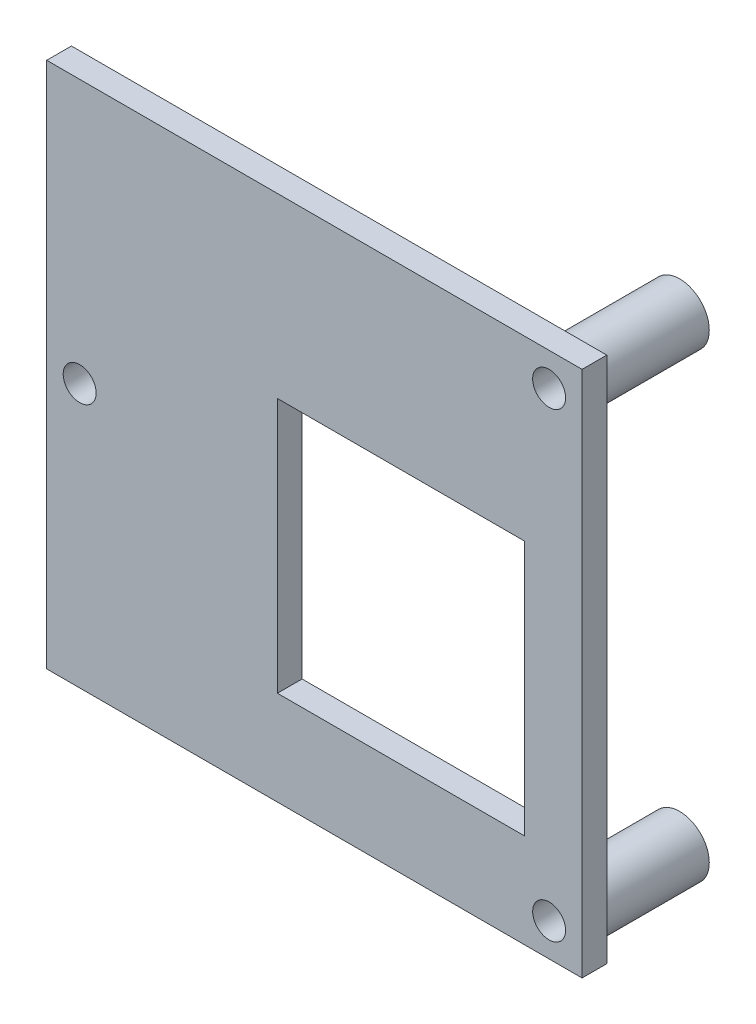
ISO-10303-21;
HEADER;
FILE_DESCRIPTION(('STEP AP214'),'2;1');
FILE_NAME('part.step','',(''),(''),'','','');
FILE_SCHEMA(('AUTOMOTIVE_DESIGN { 1 0 10303 214 1 1 1 1 }'));
ENDSEC;
DATA;
#1=APPLICATION_CONTEXT('core data for automotive mechanical design processes');
#2=APPLICATION_PROTOCOL_DEFINITION('international standard','automotive_design',2000,#1);
#3=PRODUCT_CONTEXT('',#1,'mechanical');
#4=PRODUCT('Part','Part','',(#3));
#5=PRODUCT_RELATED_PRODUCT_CATEGORY('part','',(#4));
#6=PRODUCT_DEFINITION_FORMATION('','',#4);
#7=PRODUCT_DEFINITION_CONTEXT('part definition',#1,'design');
#8=PRODUCT_DEFINITION('design','',#6,#7);
#9=PRODUCT_DEFINITION_SHAPE('','',#8);
#10=(LENGTH_UNIT() NAMED_UNIT(*) SI_UNIT(.MILLI.,.METRE.));
#11=(NAMED_UNIT(*) PLANE_ANGLE_UNIT() SI_UNIT($,.RADIAN.));
#12=(NAMED_UNIT(*) SI_UNIT($,.STERADIAN.) SOLID_ANGLE_UNIT());
#13=UNCERTAINTY_MEASURE_WITH_UNIT(LENGTH_MEASURE(1.E-05),#10,'distance_accuracy_value','');
#14=(GEOMETRIC_REPRESENTATION_CONTEXT(3) GLOBAL_UNCERTAINTY_ASSIGNED_CONTEXT((#13)) GLOBAL_UNIT_ASSIGNED_CONTEXT((#10,
#11,#12)) REPRESENTATION_CONTEXT('',''));
#15=CARTESIAN_POINT('',(0.,0.,0.));
#16=DIRECTION('',(0.,0.,1.));
#17=DIRECTION('',(1.,0.,0.));
#18=AXIS2_PLACEMENT_3D('',#15,#16,#17);
#19=CARTESIAN_POINT('',(0.,-5.58903160180357E-05,1278.62137790184));
#20=DIRECTION('',(0.,-4.3711388675316E-08,0.999999999999999));
#21=DIRECTION('',(0.,-0.999999999999999,-4.3711388675316E-08));
#22=AXIS2_PLACEMENT_3D('',#19,#20,#21);
#23=PLANE('',#22);
#24=DIRECTION('',(1.,0.,0.));
#25=VECTOR('',#24,1.);
#26=CARTESIAN_POINT('',(-227.038243781603,97.901249683913,1278.62138218125));
#27=LINE('',#26,#25);
#28=CARTESIAN_POINT('',(-227.038243781603,97.901249683913,1278.62138218125));
#29=VERTEX_POINT('',#28);
#30=CARTESIAN_POINT('',(-197.038243781603,97.901249683913,1278.62138150372));
#31=VERTEX_POINT('',#30);
#32=EDGE_CURVE('E129',#29,#31,#27,.T.);
#33=ORIENTED_EDGE('',*,*,#32,.F.);
#34=DIRECTION('',(0.,0.999999999999999,4.3711388675316E-08));
#35=VECTOR('',#34,1.);
#36=CARTESIAN_POINT('',(-227.038243781603,97.901249683913,1278.62138218125));
#37=LINE('',#36,#35);
#38=CARTESIAN_POINT('',(-227.038243781603,66.901249683913,1278.62138082619));
#39=VERTEX_POINT('',#38);
#40=EDGE_CURVE('E112',#39,#29,#37,.T.);
#41=ORIENTED_EDGE('',*,*,#40,.F.);
#42=DIRECTION('',(-1.,0.,0.));
#43=VECTOR('',#42,1.);
#44=CARTESIAN_POINT('',(-227.038243781603,66.901249683913,1278.62138082619));
#45=LINE('',#44,#43);
#46=CARTESIAN_POINT('',(-197.038243781603,66.901249683913,1278.62138082619));
#47=VERTEX_POINT('',#46);
#48=EDGE_CURVE('E121',#47,#39,#45,.T.);
#49=ORIENTED_EDGE('',*,*,#48,.F.);
#50=DIRECTION('',(0.,-0.999999999999999,-4.3711388675316E-08));
#51=VECTOR('',#50,1.);
#52=CARTESIAN_POINT('',(-197.038243781603,97.901249683913,1278.62138218125));
#53=LINE('',#52,#51);
#54=EDGE_CURVE('E60',#31,#47,#53,.T.);
#55=ORIENTED_EDGE('',*,*,#54,.F.);
#56=EDGE_LOOP('',(#33,#41,#49,#55));
#57=FACE_BOUND('',#56,.T.);
#58=CARTESIAN_POINT('',(-251.046248068345,87.4548102411924,1278.62138172462));
#59=DIRECTION('',(0.,-4.3711388675316E-08,0.999999999999999));
#60=DIRECTION('',(0.,-0.999999999999999,-4.3711388675316E-08));
#61=AXIS2_PLACEMENT_3D('',#58,#59,#60);
#62=CIRCLE('',#61,3.60000000000001);
#63=CARTESIAN_POINT('',(-251.046248068345,83.8548102411924,1278.62138156726));
#64=VERTEX_POINT('',#63);
#65=EDGE_CURVE('E53',#64,#64,#62,.F.);
#66=ORIENTED_EDGE('',*,*,#65,.F.);
#67=EDGE_LOOP('',(#66));
#68=FACE_BOUND('',#67,.T.);
#69=DIRECTION('',(1.,0.,0.));
#70=VECTOR('',#69,1.);
#71=CARTESIAN_POINT('',(-255.046248068345,55.4548102411925,1278.62138032585));
#72=LINE('',#71,#70);
#73=CARTESIAN_POINT('',(-255.046248068345,55.4548102411925,1278.62138032585));
#74=VERTEX_POINT('',#73);
#75=CARTESIAN_POINT('',(-190.046248068345,55.4548102411925,1278.62138032585));
#76=VERTEX_POINT('',#75);
#77=EDGE_CURVE('E172',#74,#76,#72,.T.);
#78=ORIENTED_EDGE('',*,*,#77,.F.);
#79=DIRECTION('',(0.,-0.999999999999999,-4.3711388675316E-08));
#80=VECTOR('',#79,1.);
#81=CARTESIAN_POINT('',(-255.046248068345,119.454810241192,1278.62138312338));
#82=LINE('',#81,#80);
#83=CARTESIAN_POINT('',(-255.046248068345,119.454810241192,1278.62138312338));
#84=VERTEX_POINT('',#83);
#85=EDGE_CURVE('E177',#84,#74,#82,.T.);
#86=ORIENTED_EDGE('',*,*,#85,.F.);
#87=DIRECTION('',(-1.,0.,0.));
#88=VECTOR('',#87,1.);
#89=CARTESIAN_POINT('',(-190.046248068345,119.454810241192,1278.62138312338));
#90=LINE('',#89,#88);
#91=CARTESIAN_POINT('',(-190.046248068345,119.454810241192,1278.62138312338));
#92=VERTEX_POINT('',#91);
#93=EDGE_CURVE('E188',#92,#84,#90,.T.);
#94=ORIENTED_EDGE('',*,*,#93,.F.);
#95=DIRECTION('',(0.,0.999999999999999,4.3711388675316E-08));
#96=VECTOR('',#95,1.);
#97=CARTESIAN_POINT('',(-190.046248068345,55.4548102411925,1278.62138032585));
#98=LINE('',#97,#96);
#99=EDGE_CURVE('E186',#76,#92,#98,.T.);
#100=ORIENTED_EDGE('',*,*,#99,.F.);
#101=EDGE_LOOP('',(#78,#86,#94,#100));
#102=FACE_BOUND('',#101,.T.);
#103=CARTESIAN_POINT('',(-194.046248068345,115.454810241192,1278.62138294854));
#104=DIRECTION('',(0.,-4.3711388675316E-08,0.999999999999999));
#105=DIRECTION('',(0.,-0.999999999999999,-4.3711388675316E-08));
#106=AXIS2_PLACEMENT_3D('',#103,#104,#105);
#107=CIRCLE('',#106,3.59999999999999);
#108=CARTESIAN_POINT('',(-194.046248068345,111.854810241192,1278.62138279118));
#109=VERTEX_POINT('',#108);
#110=EDGE_CURVE('E202',#109,#109,#107,.F.);
#111=ORIENTED_EDGE('',*,*,#110,.F.);
#112=EDGE_LOOP('',(#111));
#113=FACE_BOUND('',#112,.T.);
#114=CARTESIAN_POINT('',(-194.046248068345,59.4548102411925,1278.6213805007));
#115=DIRECTION('',(0.,-4.3711388675316E-08,0.999999999999999));
#116=DIRECTION('',(0.,-0.999999999999999,-4.3711388675316E-08));
#117=AXIS2_PLACEMENT_3D('',#114,#115,#116);
#118=CIRCLE('',#117,3.59999999999999);
#119=CARTESIAN_POINT('',(-194.046248068345,55.8548102411925,1278.62138034334));
#120=VERTEX_POINT('',#119);
#121=EDGE_CURVE('E11',#120,#120,#118,.F.);
#122=ORIENTED_EDGE('',*,*,#121,.F.);
#123=EDGE_LOOP('',(#122));
#124=FACE_BOUND('',#123,.T.);
#125=ADVANCED_FACE('F45',(#57,#68,#102,#113,#124),#23,.F.);
#126=CARTESIAN_POINT('',(-255.046248068345,55.4548101100584,1281.62138032585));
#127=DIRECTION('',(0.,0.999999999999999,4.3711388E-08));
#128=DIRECTION('',(0.,-4.3711388E-08,0.999999999999999));
#129=AXIS2_PLACEMENT_3D('',#126,#127,#128);
#130=PLANE('',#129);
#131=ORIENTED_EDGE('',*,*,#77,.T.);
#132=DIRECTION('',(0.,4.3711388E-08,-0.999999999999999));
#133=VECTOR('',#132,1.);
#134=CARTESIAN_POINT('',(-190.046248068345,55.4548101100584,1281.62138032585));
#135=LINE('',#134,#133);
#136=CARTESIAN_POINT('',(-190.046248068345,55.4548101100584,1281.62138032585));
#137=VERTEX_POINT('',#136);
#138=EDGE_CURVE('E199',#137,#76,#135,.T.);
#139=ORIENTED_EDGE('',*,*,#138,.F.);
#140=DIRECTION('',(1.,0.,0.));
#141=VECTOR('',#140,1.);
#142=CARTESIAN_POINT('',(-255.046248068345,55.4548101100584,1281.62138032585));
#143=LINE('',#142,#141);
#144=CARTESIAN_POINT('',(-255.046248068345,55.4548101100584,1281.62138032585));
#145=VERTEX_POINT('',#144);
#146=EDGE_CURVE('E173',#145,#137,#143,.T.);
#147=ORIENTED_EDGE('',*,*,#146,.F.);
#148=DIRECTION('',(0.,4.3711388E-08,-0.999999999999999));
#149=VECTOR('',#148,1.);
#150=CARTESIAN_POINT('',(-255.046248068345,55.4548101100584,1281.62138032585));
#151=LINE('',#150,#149);
#152=EDGE_CURVE('E183',#145,#74,#151,.T.);
#153=ORIENTED_EDGE('',*,*,#152,.T.);
#154=EDGE_LOOP('',(#131,#139,#147,#153));
#155=FACE_BOUND('',#154,.T.);
#156=ADVANCED_FACE('F47',(#155),#130,.F.);
#157=CARTESIAN_POINT('',(-190.046248068345,55.4548101100584,1281.62138032585));
#158=DIRECTION('',(-1.,0.,0.));
#159=DIRECTION('',(0.,0.,1.));
#160=AXIS2_PLACEMENT_3D('',#157,#158,#159);
#161=PLANE('',#160);
#162=ORIENTED_EDGE('',*,*,#99,.T.);
#163=DIRECTION('',(0.,4.3711388E-08,-0.999999999999999));
#164=VECTOR('',#163,1.);
#165=CARTESIAN_POINT('',(-190.046248068345,119.454810110058,1281.62138312338));
#166=LINE('',#165,#164);
#167=CARTESIAN_POINT('',(-190.046248068345,119.454810110058,1281.62138312338));
#168=VERTEX_POINT('',#167);
#169=EDGE_CURVE('E196',#168,#92,#166,.T.);
#170=ORIENTED_EDGE('',*,*,#169,.F.);
#171=DIRECTION('',(0.,0.999999999999999,4.3711388675316E-08));
#172=VECTOR('',#171,1.);
#173=CARTESIAN_POINT('',(-190.046248068345,55.4548101100584,1281.62138032585));
#174=LINE('',#173,#172);
#175=EDGE_CURVE('E176',#137,#168,#174,.T.);
#176=ORIENTED_EDGE('',*,*,#175,.F.);
#177=ORIENTED_EDGE('',*,*,#138,.T.);
#178=EDGE_LOOP('',(#162,#170,#176,#177));
#179=FACE_BOUND('',#178,.T.);
#180=ADVANCED_FACE('F267',(#179),#161,.F.);
#181=CARTESIAN_POINT('',(-190.046248068345,119.454810110058,1281.62138312338));
#182=DIRECTION('',(0.,-0.999999999999999,-4.3711388E-08));
#183=DIRECTION('',(0.,4.3711388E-08,-0.999999999999999));
#184=AXIS2_PLACEMENT_3D('',#181,#182,#183);
#185=PLANE('',#184);
#186=ORIENTED_EDGE('',*,*,#93,.T.);
#187=DIRECTION('',(0.,4.3711388E-08,-0.999999999999999));
#188=VECTOR('',#187,1.);
#189=CARTESIAN_POINT('',(-255.046248068345,119.454810110058,1281.62138312338));
#190=LINE('',#189,#188);
#191=CARTESIAN_POINT('',(-255.046248068345,119.454810110058,1281.62138312338));
#192=VERTEX_POINT('',#191);
#193=EDGE_CURVE('E193',#192,#84,#190,.T.);
#194=ORIENTED_EDGE('',*,*,#193,.F.);
#195=DIRECTION('',(-1.,0.,0.));
#196=VECTOR('',#195,1.);
#197=CARTESIAN_POINT('',(-190.046248068345,119.454810110058,1281.62138312338));
#198=LINE('',#197,#196);
#199=EDGE_CURVE('E179',#168,#192,#198,.T.);
#200=ORIENTED_EDGE('',*,*,#199,.F.);
#201=ORIENTED_EDGE('',*,*,#169,.T.);
#202=EDGE_LOOP('',(#186,#194,#200,#201));
#203=FACE_BOUND('',#202,.T.);
#204=ADVANCED_FACE('F264',(#203),#185,.F.);
#205=CARTESIAN_POINT('',(-255.046248068345,119.454810110058,1281.62138312338));
#206=DIRECTION('',(1.,0.,0.));
#207=DIRECTION('',(0.,0.,-1.));
#208=AXIS2_PLACEMENT_3D('',#205,#206,#207);
#209=PLANE('',#208);
#210=ORIENTED_EDGE('',*,*,#85,.T.);
#211=ORIENTED_EDGE('',*,*,#152,.F.);
#212=DIRECTION('',(0.,-0.999999999999999,-4.3711388675316E-08));
#213=VECTOR('',#212,1.);
#214=CARTESIAN_POINT('',(-255.046248068345,119.454810110058,1281.62138312338));
#215=LINE('',#214,#213);
#216=EDGE_CURVE('E181',#192,#145,#215,.T.);
#217=ORIENTED_EDGE('',*,*,#216,.F.);
#218=ORIENTED_EDGE('',*,*,#193,.T.);
#219=EDGE_LOOP('',(#210,#211,#217,#218));
#220=FACE_BOUND('',#219,.T.);
#221=ADVANCED_FACE('F259',(#220),#209,.F.);
#222=CARTESIAN_POINT('',(0.,-5.60214501820357E-05,1281.62137790184));
#223=DIRECTION('',(0.,-4.3711388675316E-08,0.999999999999999));
#224=DIRECTION('',(0.,-0.999999999999999,-4.3711388675316E-08));
#225=AXIS2_PLACEMENT_3D('',#222,#223,#224);
#226=PLANE('',#225);
#227=DIRECTION('',(0.,-0.999999999999999,-4.37113857654572E-08));
#228=VECTOR('',#227,1.);
#229=CARTESIAN_POINT('',(-227.038243781603,97.9012495527788,1281.62138218125));
#230=LINE('',#229,#228);
#231=CARTESIAN_POINT('',(-227.038243781603,97.9012495527788,1281.62138218125));
#232=VERTEX_POINT('',#231);
#233=CARTESIAN_POINT('',(-227.038243781603,66.9012495527788,1281.62138082619));
#234=VERTEX_POINT('',#233);
#235=EDGE_CURVE('E68',#232,#234,#230,.T.);
#236=ORIENTED_EDGE('',*,*,#235,.F.);
#237=DIRECTION('',(-1.,0.,0.));
#238=VECTOR('',#237,1.);
#239=CARTESIAN_POINT('',(-227.038243781603,97.9012495527788,1281.62138218125));
#240=LINE('',#239,#238);
#241=CARTESIAN_POINT('',(-197.038243781603,97.9012495527788,1281.62138218125));
#242=VERTEX_POINT('',#241);
#243=EDGE_CURVE('E118',#242,#232,#240,.T.);
#244=ORIENTED_EDGE('',*,*,#243,.F.);
#245=DIRECTION('',(0.,0.999999999999999,4.37113857654572E-08));
#246=VECTOR('',#245,1.);
#247=CARTESIAN_POINT('',(-197.038243781603,97.9012495527788,1281.62138218125));
#248=LINE('',#247,#246);
#249=CARTESIAN_POINT('',(-197.038243781603,66.9012495527788,1281.62138082619));
#250=VERTEX_POINT('',#249);
#251=EDGE_CURVE('E137',#250,#242,#248,.T.);
#252=ORIENTED_EDGE('',*,*,#251,.F.);
#253=DIRECTION('',(1.,0.,0.));
#254=VECTOR('',#253,1.);
#255=CARTESIAN_POINT('',(-227.038243781603,66.9012495527788,1281.62138082619));
#256=LINE('',#255,#254);
#257=EDGE_CURVE('E131',#234,#250,#256,.T.);
#258=ORIENTED_EDGE('',*,*,#257,.F.);
#259=EDGE_LOOP('',(#236,#244,#252,#258));
#260=FACE_BOUND('',#259,.T.);
#261=CARTESIAN_POINT('',(-251.046248068345,87.4548101100582,1281.62138172462));
#262=DIRECTION('',(0.,-4.3711388675316E-08,0.999999999999999));
#263=DIRECTION('',(0.,-0.999999999999999,-4.3711388675316E-08));
#264=AXIS2_PLACEMENT_3D('',#261,#262,#263);
#265=CIRCLE('',#264,2.);
#266=CARTESIAN_POINT('',(-251.046248068345,85.4548101100582,1281.6213816372));
#267=VERTEX_POINT('',#266);
#268=EDGE_CURVE('E163',#267,#267,#265,.T.);
#269=ORIENTED_EDGE('',*,*,#268,.F.);
#270=EDGE_LOOP('',(#269));
#271=FACE_BOUND('',#270,.T.);
#272=CARTESIAN_POINT('',(-194.046248068345,115.454810110058,1281.62138294854));
#273=DIRECTION('',(0.,-4.3711388675316E-08,0.999999999999999));
#274=DIRECTION('',(0.,-0.999999999999999,-4.3711388675316E-08));
#275=AXIS2_PLACEMENT_3D('',#272,#273,#274);
#276=CIRCLE('',#275,2.);
#277=CARTESIAN_POINT('',(-194.046248068345,113.454810110058,1281.62138286112));
#278=VERTEX_POINT('',#277);
#279=EDGE_CURVE('E166',#278,#278,#276,.T.);
#280=ORIENTED_EDGE('',*,*,#279,.F.);
#281=EDGE_LOOP('',(#280));
#282=FACE_BOUND('',#281,.T.);
#283=CARTESIAN_POINT('',(-194.046248068345,59.4548101100583,1281.6213805007));
#284=DIRECTION('',(0.,-4.3711388675316E-08,0.999999999999999));
#285=DIRECTION('',(0.,-0.999999999999999,-4.3711388675316E-08));
#286=AXIS2_PLACEMENT_3D('',#283,#284,#285);
#287=CIRCLE('',#286,2.);
#288=CARTESIAN_POINT('',(-194.046248068345,57.4548101100583,1281.62138041328));
#289=VERTEX_POINT('',#288);
#290=EDGE_CURVE('E169',#289,#289,#287,.T.);
#291=ORIENTED_EDGE('',*,*,#290,.F.);
#292=EDGE_LOOP('',(#291));
#293=FACE_BOUND('',#292,.T.);
#294=ORIENTED_EDGE('',*,*,#146,.T.);
#295=ORIENTED_EDGE('',*,*,#175,.T.);
#296=ORIENTED_EDGE('',*,*,#199,.T.);
#297=ORIENTED_EDGE('',*,*,#216,.T.);
#298=EDGE_LOOP('',(#294,#295,#296,#297));
#299=FACE_BOUND('',#298,.T.);
#300=ADVANCED_FACE('F256',(#260,#271,#282,#293,#299),#226,.T.);
#301=CARTESIAN_POINT('',(-194.046248068345,59.4548101100583,1281.6213805007));
#302=DIRECTION('',(0.,-4.3711388675316E-08,0.999999999999999));
#303=DIRECTION('',(0.,-0.999999999999999,-4.3711388675316E-08));
#304=AXIS2_PLACEMENT_3D('',#301,#302,#303);
#305=CYLINDRICAL_SURFACE('',#304,2.);
#306=ORIENTED_EDGE('',*,*,#290,.T.);
#307=EDGE_LOOP('',(#306));
#308=FACE_BOUND('',#307,.T.);
#309=CARTESIAN_POINT('',(-194.046248068345,59.4548108026905,1265.7758021895));
#310=DIRECTION('',(0.,0.,1.));
#311=DIRECTION('',(1.,0.,0.));
#312=AXIS2_PLACEMENT_3D('',#309,#310,#311);
#313=CIRCLE('',#312,1.99999999999998);
#314=CARTESIAN_POINT('',(-192.046248068345,59.4548108026905,1265.7758021895));
#315=VERTEX_POINT('',#314);
#316=EDGE_CURVE('E124',#315,#315,#313,.T.);
#317=ORIENTED_EDGE('',*,*,#316,.F.);
#318=EDGE_LOOP('',(#317));
#319=FACE_BOUND('',#318,.T.);
#320=ADVANCED_FACE('F252',(#308,#319),#305,.F.);
#321=CARTESIAN_POINT('',(-194.046248068345,115.454810110058,1281.62138294854));
#322=DIRECTION('',(0.,-4.3711388675316E-08,0.999999999999999));
#323=DIRECTION('',(0.,-0.999999999999999,-4.3711388675316E-08));
#324=AXIS2_PLACEMENT_3D('',#321,#322,#323);
#325=CYLINDRICAL_SURFACE('',#324,2.);
#326=ORIENTED_EDGE('',*,*,#279,.T.);
#327=EDGE_LOOP('',(#326));
#328=FACE_BOUND('',#327,.T.);
#329=CARTESIAN_POINT('',(-194.046248068345,115.454810802691,1265.7758021895));
#330=DIRECTION('',(0.,0.,1.));
#331=DIRECTION('',(1.,0.,0.));
#332=AXIS2_PLACEMENT_3D('',#329,#330,#331);
#333=CIRCLE('',#332,1.99999999999998);
#334=CARTESIAN_POINT('',(-192.046248068345,115.454810802691,1265.7758021895));
#335=VERTEX_POINT('',#334);
#336=EDGE_CURVE('E160',#335,#335,#333,.T.);
#337=ORIENTED_EDGE('',*,*,#336,.F.);
#338=EDGE_LOOP('',(#337));
#339=FACE_BOUND('',#338,.T.);
#340=ADVANCED_FACE('F248',(#328,#339),#325,.F.);
#341=CARTESIAN_POINT('',(-251.046248068345,87.4548101100582,1281.62138172462));
#342=DIRECTION('',(0.,-4.3711388675316E-08,0.999999999999999));
#343=DIRECTION('',(0.,-0.999999999999999,-4.3711388675316E-08));
#344=AXIS2_PLACEMENT_3D('',#341,#342,#343);
#345=CYLINDRICAL_SURFACE('',#344,2.);
#346=ORIENTED_EDGE('',*,*,#268,.T.);
#347=EDGE_LOOP('',(#346));
#348=FACE_BOUND('',#347,.T.);
#349=CARTESIAN_POINT('',(-251.046248068345,87.4548108026905,1265.7758021895));
#350=DIRECTION('',(0.,0.,1.));
#351=DIRECTION('',(1.,0.,0.));
#352=AXIS2_PLACEMENT_3D('',#349,#350,#351);
#353=CIRCLE('',#352,1.99999999999999);
#354=CARTESIAN_POINT('',(-249.046248068345,87.4548108026905,1265.7758021895));
#355=VERTEX_POINT('',#354);
#356=EDGE_CURVE('E151',#355,#355,#353,.T.);
#357=ORIENTED_EDGE('',*,*,#356,.F.);
#358=EDGE_LOOP('',(#357));
#359=FACE_BOUND('',#358,.T.);
#360=ADVANCED_FACE('F241',(#348,#359),#345,.F.);
#361=CARTESIAN_POINT('',(-194.046248068345,115.454811247775,1255.59346454041));
#362=DIRECTION('',(0.,-4.3711388675316E-08,0.999999999999999));
#363=DIRECTION('',(0.,-0.999999999999999,-4.3711388675316E-08));
#364=AXIS2_PLACEMENT_3D('',#361,#362,#363);
#365=CYLINDRICAL_SURFACE('',#364,3.59999999999999);
#366=CARTESIAN_POINT('',(-194.046248068345,115.454810802691,1265.7758021895));
#367=DIRECTION('',(0.,0.,1.));
#368=DIRECTION('',(1.,0.,0.));
#369=AXIS2_PLACEMENT_3D('',#366,#367,#368);
#370=CIRCLE('',#369,3.59999999999999);
#371=CARTESIAN_POINT('',(-190.446248068345,115.454810802691,1265.7758021895));
#372=VERTEX_POINT('',#371);
#373=EDGE_CURVE('E157',#372,#372,#370,.T.);
#374=ORIENTED_EDGE('',*,*,#373,.T.);
#375=EDGE_LOOP('',(#374));
#376=FACE_BOUND('',#375,.T.);
#377=ORIENTED_EDGE('',*,*,#110,.T.);
#378=EDGE_LOOP('',(#377));
#379=FACE_BOUND('',#378,.T.);
#380=ADVANCED_FACE('F238',(#376,#379),#365,.T.);
#381=CARTESIAN_POINT('',(-222.546248068345,87.4548108026905,1265.7758021895));
#382=DIRECTION('',(0.,0.,1.));
#383=DIRECTION('',(1.,0.,0.));
#384=AXIS2_PLACEMENT_3D('',#381,#382,#383);
#385=PLANE('',#384);
#386=ORIENTED_EDGE('',*,*,#336,.T.);
#387=EDGE_LOOP('',(#386));
#388=FACE_BOUND('',#387,.T.);
#389=ORIENTED_EDGE('',*,*,#373,.F.);
#390=EDGE_LOOP('',(#389));
#391=FACE_BOUND('',#390,.T.);
#392=ADVANCED_FACE('F236',(#388,#391),#385,.F.);
#393=CARTESIAN_POINT('',(-251.046248068345,87.4548112477747,1255.5934633165));
#394=DIRECTION('',(0.,-4.3711388675316E-08,0.999999999999999));
#395=DIRECTION('',(0.,-0.999999999999999,-4.3711388675316E-08));
#396=AXIS2_PLACEMENT_3D('',#393,#394,#395);
#397=CYLINDRICAL_SURFACE('',#396,3.60000000000001);
#398=CARTESIAN_POINT('',(-251.046248068345,87.4548108026905,1265.7758021895));
#399=DIRECTION('',(0.,0.,1.));
#400=DIRECTION('',(1.,0.,0.));
#401=AXIS2_PLACEMENT_3D('',#398,#399,#400);
#402=CIRCLE('',#401,3.60000000000001);
#403=CARTESIAN_POINT('',(-247.446248068345,87.4548108026905,1265.7758021895));
#404=VERTEX_POINT('',#403);
#405=EDGE_CURVE('E154',#404,#404,#402,.T.);
#406=ORIENTED_EDGE('',*,*,#405,.T.);
#407=EDGE_LOOP('',(#406));
#408=FACE_BOUND('',#407,.T.);
#409=ORIENTED_EDGE('',*,*,#65,.T.);
#410=EDGE_LOOP('',(#409));
#411=FACE_BOUND('',#410,.T.);
#412=ADVANCED_FACE('F207',(#408,#411),#397,.T.);
#413=CARTESIAN_POINT('',(-222.546248068345,87.4548108026905,1265.7758021895));
#414=DIRECTION('',(0.,0.,1.));
#415=DIRECTION('',(1.,0.,0.));
#416=AXIS2_PLACEMENT_3D('',#413,#414,#415);
#417=PLANE('',#416);
#418=ORIENTED_EDGE('',*,*,#356,.T.);
#419=EDGE_LOOP('',(#418));
#420=FACE_BOUND('',#419,.T.);
#421=ORIENTED_EDGE('',*,*,#405,.F.);
#422=EDGE_LOOP('',(#421));
#423=FACE_BOUND('',#422,.T.);
#424=ADVANCED_FACE('F221',(#420,#423),#417,.F.);
#425=CARTESIAN_POINT('',(-194.046248068345,59.4548112477748,1255.59346209258));
#426=DIRECTION('',(0.,-4.3711388675316E-08,0.999999999999999));
#427=DIRECTION('',(0.,-0.999999999999999,-4.3711388675316E-08));
#428=AXIS2_PLACEMENT_3D('',#425,#426,#427);
#429=CYLINDRICAL_SURFACE('',#428,3.59999999999999);
#430=CARTESIAN_POINT('',(-194.046248068345,59.4548108026905,1265.7758021895));
#431=DIRECTION('',(0.,0.,1.));
#432=DIRECTION('',(1.,0.,0.));
#433=AXIS2_PLACEMENT_3D('',#430,#431,#432);
#434=CIRCLE('',#433,3.59999999999999);
#435=CARTESIAN_POINT('',(-190.446248068345,59.4548108026905,1265.7758021895));
#436=VERTEX_POINT('',#435);
#437=EDGE_CURVE('E148',#436,#436,#434,.T.);
#438=ORIENTED_EDGE('',*,*,#437,.T.);
#439=EDGE_LOOP('',(#438));
#440=FACE_BOUND('',#439,.T.);
#441=ORIENTED_EDGE('',*,*,#121,.T.);
#442=EDGE_LOOP('',(#441));
#443=FACE_BOUND('',#442,.T.);
#444=ADVANCED_FACE('F218',(#440,#443),#429,.T.);
#445=CARTESIAN_POINT('',(-222.546248068345,87.4548108026905,1265.7758021895));
#446=DIRECTION('',(0.,0.,1.));
#447=DIRECTION('',(1.,0.,0.));
#448=AXIS2_PLACEMENT_3D('',#445,#446,#447);
#449=PLANE('',#448);
#450=ORIENTED_EDGE('',*,*,#316,.T.);
#451=EDGE_LOOP('',(#450));
#452=FACE_BOUND('',#451,.T.);
#453=ORIENTED_EDGE('',*,*,#437,.F.);
#454=EDGE_LOOP('',(#453));
#455=FACE_BOUND('',#454,.T.);
#456=ADVANCED_FACE('F220',(#452,#455),#449,.F.);
#457=CARTESIAN_POINT('',(-227.038243781603,97.9012502454549,1265.77480124732));
#458=DIRECTION('',(-1.,0.,0.));
#459=DIRECTION('',(0.,0.,1.));
#460=AXIS2_PLACEMENT_3D('',#457,#458,#459);
#461=PLANE('',#460);
#462=ORIENTED_EDGE('',*,*,#40,.T.);
#463=DIRECTION('',(0.,-4.3711388675316E-08,0.999999999999999));
#464=VECTOR('',#463,1.);
#465=CARTESIAN_POINT('',(-227.038243781603,97.9012502454549,1265.77480124732));
#466=LINE('',#465,#464);
#467=EDGE_CURVE('E125',#29,#232,#466,.T.);
#468=ORIENTED_EDGE('',*,*,#467,.T.);
#469=ORIENTED_EDGE('',*,*,#235,.T.);
#470=DIRECTION('',(0.,-4.3711388675316E-08,0.999999999999999));
#471=VECTOR('',#470,1.);
#472=CARTESIAN_POINT('',(-227.038243781603,66.9012502454549,1265.77479989227));
#473=LINE('',#472,#471);
#474=EDGE_CURVE('E108',#39,#234,#473,.T.);
#475=ORIENTED_EDGE('',*,*,#474,.F.);
#476=EDGE_LOOP('',(#462,#468,#469,#475));
#477=FACE_BOUND('',#476,.T.);
#478=ADVANCED_FACE('F110',(#477),#461,.F.);
#479=CARTESIAN_POINT('',(-227.038243781603,97.9012502454549,1265.77480124732));
#480=DIRECTION('',(0.,0.999999999999999,4.3711388675316E-08));
#481=DIRECTION('',(0.,-4.3711388675316E-08,0.999999999999999));
#482=AXIS2_PLACEMENT_3D('',#479,#480,#481);
#483=PLANE('',#482);
#484=ORIENTED_EDGE('',*,*,#32,.T.);
#485=DIRECTION('',(0.,-4.3711388675316E-08,0.999999999999999));
#486=VECTOR('',#485,1.);
#487=CARTESIAN_POINT('',(-197.038243781603,97.9012502454549,1265.77480124732));
#488=LINE('',#487,#486);
#489=EDGE_CURVE('E143',#31,#242,#488,.T.);
#490=ORIENTED_EDGE('',*,*,#489,.T.);
#491=ORIENTED_EDGE('',*,*,#243,.T.);
#492=ORIENTED_EDGE('',*,*,#467,.F.);
#493=EDGE_LOOP('',(#484,#490,#491,#492));
#494=FACE_BOUND('',#493,.T.);
#495=ADVANCED_FACE('F375',(#494),#483,.F.);
#496=CARTESIAN_POINT('',(-197.038243781603,97.9012502454549,1265.77480124732));
#497=DIRECTION('',(1.,0.,0.));
#498=DIRECTION('',(0.,0.,-1.));
#499=AXIS2_PLACEMENT_3D('',#496,#497,#498);
#500=PLANE('',#499);
#501=ORIENTED_EDGE('',*,*,#54,.T.);
#502=DIRECTION('',(0.,-4.3711388675316E-08,0.999999999999999));
#503=VECTOR('',#502,1.);
#504=CARTESIAN_POINT('',(-197.038243781603,66.9012502454549,1265.77479989227));
#505=LINE('',#504,#503);
#506=EDGE_CURVE('E117',#47,#250,#505,.T.);
#507=ORIENTED_EDGE('',*,*,#506,.T.);
#508=ORIENTED_EDGE('',*,*,#251,.T.);
#509=ORIENTED_EDGE('',*,*,#489,.F.);
#510=EDGE_LOOP('',(#501,#507,#508,#509));
#511=FACE_BOUND('',#510,.T.);
#512=ADVANCED_FACE('F382',(#511),#500,.F.);
#513=CARTESIAN_POINT('',(-227.038243781603,66.9012502454549,1265.77479989227));
#514=DIRECTION('',(0.,-0.999999999999999,-4.3711388675316E-08));
#515=DIRECTION('',(0.,4.3711388675316E-08,-0.999999999999999));
#516=AXIS2_PLACEMENT_3D('',#513,#514,#515);
#517=PLANE('',#516);
#518=ORIENTED_EDGE('',*,*,#48,.T.);
#519=ORIENTED_EDGE('',*,*,#474,.T.);
#520=ORIENTED_EDGE('',*,*,#257,.T.);
#521=ORIENTED_EDGE('',*,*,#506,.F.);
#522=EDGE_LOOP('',(#518,#519,#520,#521));
#523=FACE_BOUND('',#522,.T.);
#524=ADVANCED_FACE('F122',(#523),#517,.F.);
#525=CLOSED_SHELL('',(#125,#156,#180,#204,#221,#300,#320,#340,#360,#380,#392,#412,#424,#444,
#456,#478,#495,#512,#524));
#526=MANIFOLD_SOLID_BREP('B2',#525);
#527=ADVANCED_BREP_SHAPE_REPRESENTATION('',(#18,#526),#14);
#528=SHAPE_DEFINITION_REPRESENTATION(#9,#527);
ENDSEC;
END-ISO-10303-21;
